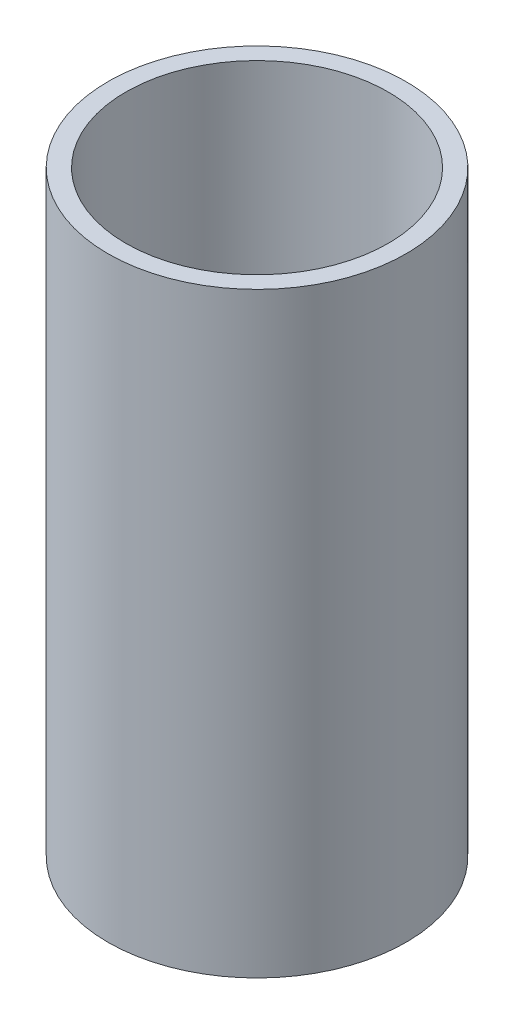
ISO-10303-21;
HEADER;
FILE_DESCRIPTION(('STEP AP214'),'2;1');
FILE_NAME('part.step','',(''),(''),'','','');
FILE_SCHEMA(('AUTOMOTIVE_DESIGN { 1 0 10303 214 1 1 1 1 }'));
ENDSEC;
DATA;
#1=APPLICATION_CONTEXT('core data for automotive mechanical design processes');
#2=APPLICATION_PROTOCOL_DEFINITION('international standard','automotive_design',2000,#1);
#3=PRODUCT_CONTEXT('',#1,'mechanical');
#4=PRODUCT('Part','Part','',(#3));
#5=PRODUCT_RELATED_PRODUCT_CATEGORY('part','',(#4));
#6=PRODUCT_DEFINITION_FORMATION('','',#4);
#7=PRODUCT_DEFINITION_CONTEXT('part definition',#1,'design');
#8=PRODUCT_DEFINITION('design','',#6,#7);
#9=PRODUCT_DEFINITION_SHAPE('','',#8);
#10=(LENGTH_UNIT() NAMED_UNIT(*) SI_UNIT(.MILLI.,.METRE.));
#11=(NAMED_UNIT(*) PLANE_ANGLE_UNIT() SI_UNIT($,.RADIAN.));
#12=(NAMED_UNIT(*) SI_UNIT($,.STERADIAN.) SOLID_ANGLE_UNIT());
#13=UNCERTAINTY_MEASURE_WITH_UNIT(LENGTH_MEASURE(1.E-05),#10,'distance_accuracy_value','');
#14=(GEOMETRIC_REPRESENTATION_CONTEXT(3) GLOBAL_UNCERTAINTY_ASSIGNED_CONTEXT((#13)) GLOBAL_UNIT_ASSIGNED_CONTEXT((#10,
#11,#12)) REPRESENTATION_CONTEXT('',''));
#15=CARTESIAN_POINT('',(0.,0.,0.));
#16=DIRECTION('',(0.,0.,1.));
#17=DIRECTION('',(1.,0.,0.));
#18=AXIS2_PLACEMENT_3D('',#15,#16,#17);
#19=CARTESIAN_POINT('',(0.,100.,0.));
#20=DIRECTION('',(0.,1.,0.));
#21=DIRECTION('',(0.,0.,1.));
#22=AXIS2_PLACEMENT_3D('',#19,#20,#21);
#23=PLANE('',#22);
#24=CARTESIAN_POINT('',(0.,100.,0.));
#25=DIRECTION('',(0.,1.,0.));
#26=DIRECTION('',(0.,0.,1.));
#27=AXIS2_PLACEMENT_3D('',#24,#25,#26);
#28=CIRCLE('',#27,25.);
#29=CARTESIAN_POINT('',(0.,100.,25.));
#30=VERTEX_POINT('',#29);
#31=EDGE_CURVE('E10',#30,#30,#28,.T.);
#32=ORIENTED_EDGE('',*,*,#31,.T.);
#33=EDGE_LOOP('',(#32));
#34=FACE_BOUND('',#33,.T.);
#35=CARTESIAN_POINT('',(0.,100.,0.));
#36=DIRECTION('',(0.,1.,0.));
#37=DIRECTION('',(0.,0.,1.));
#38=AXIS2_PLACEMENT_3D('',#35,#36,#37);
#39=CIRCLE('',#38,22.);
#40=CARTESIAN_POINT('',(0.,100.,22.));
#41=VERTEX_POINT('',#40);
#42=EDGE_CURVE('E50',#41,#41,#39,.T.);
#43=ORIENTED_EDGE('',*,*,#42,.F.);
#44=EDGE_LOOP('',(#43));
#45=FACE_BOUND('',#44,.T.);
#46=ADVANCED_FACE('F37',(#34,#45),#23,.T.);
#47=CARTESIAN_POINT('',(0.,0.,0.));
#48=DIRECTION('',(0.,1.,0.));
#49=DIRECTION('',(0.,0.,1.));
#50=AXIS2_PLACEMENT_3D('',#47,#48,#49);
#51=PLANE('',#50);
#52=CARTESIAN_POINT('',(0.,0.,0.));
#53=DIRECTION('',(0.,1.,0.));
#54=DIRECTION('',(0.,0.,1.));
#55=AXIS2_PLACEMENT_3D('',#52,#53,#54);
#56=CIRCLE('',#55,25.);
#57=CARTESIAN_POINT('',(0.,0.,25.));
#58=VERTEX_POINT('',#57);
#59=EDGE_CURVE('E41',#58,#58,#56,.T.);
#60=ORIENTED_EDGE('',*,*,#59,.F.);
#61=EDGE_LOOP('',(#60));
#62=FACE_BOUND('',#61,.T.);
#63=CARTESIAN_POINT('',(0.,0.,0.));
#64=DIRECTION('',(0.,1.,0.));
#65=DIRECTION('',(0.,0.,1.));
#66=AXIS2_PLACEMENT_3D('',#63,#64,#65);
#67=CIRCLE('',#66,22.);
#68=CARTESIAN_POINT('',(0.,0.,22.));
#69=VERTEX_POINT('',#68);
#70=EDGE_CURVE('E52',#69,#69,#67,.T.);
#71=ORIENTED_EDGE('',*,*,#70,.T.);
#72=EDGE_LOOP('',(#71));
#73=FACE_BOUND('',#72,.T.);
#74=ADVANCED_FACE('F64',(#62,#73),#51,.F.);
#75=CARTESIAN_POINT('',(0.,100.,0.));
#76=DIRECTION('',(0.,-1.,0.));
#77=DIRECTION('',(0.,0.,-1.));
#78=AXIS2_PLACEMENT_3D('',#75,#76,#77);
#79=CYLINDRICAL_SURFACE('',#78,25.);
#80=ORIENTED_EDGE('',*,*,#31,.F.);
#81=EDGE_LOOP('',(#80));
#82=FACE_BOUND('',#81,.T.);
#83=ORIENTED_EDGE('',*,*,#59,.T.);
#84=EDGE_LOOP('',(#83));
#85=FACE_BOUND('',#84,.T.);
#86=ADVANCED_FACE('F39',(#82,#85),#79,.T.);
#87=CARTESIAN_POINT('',(0.,100.,0.));
#88=DIRECTION('',(0.,-1.,0.));
#89=DIRECTION('',(0.,0.,-1.));
#90=AXIS2_PLACEMENT_3D('',#87,#88,#89);
#91=CYLINDRICAL_SURFACE('',#90,22.);
#92=ORIENTED_EDGE('',*,*,#42,.T.);
#93=EDGE_LOOP('',(#92));
#94=FACE_BOUND('',#93,.T.);
#95=ORIENTED_EDGE('',*,*,#70,.F.);
#96=EDGE_LOOP('',(#95));
#97=FACE_BOUND('',#96,.T.);
#98=ADVANCED_FACE('F60',(#94,#97),#91,.F.);
#99=CLOSED_SHELL('',(#46,#74,#86,#98));
#100=MANIFOLD_SOLID_BREP('B2',#99);
#101=ADVANCED_BREP_SHAPE_REPRESENTATION('',(#18,#100),#14);
#102=SHAPE_DEFINITION_REPRESENTATION(#9,#101);
ENDSEC;
END-ISO-10303-21;
